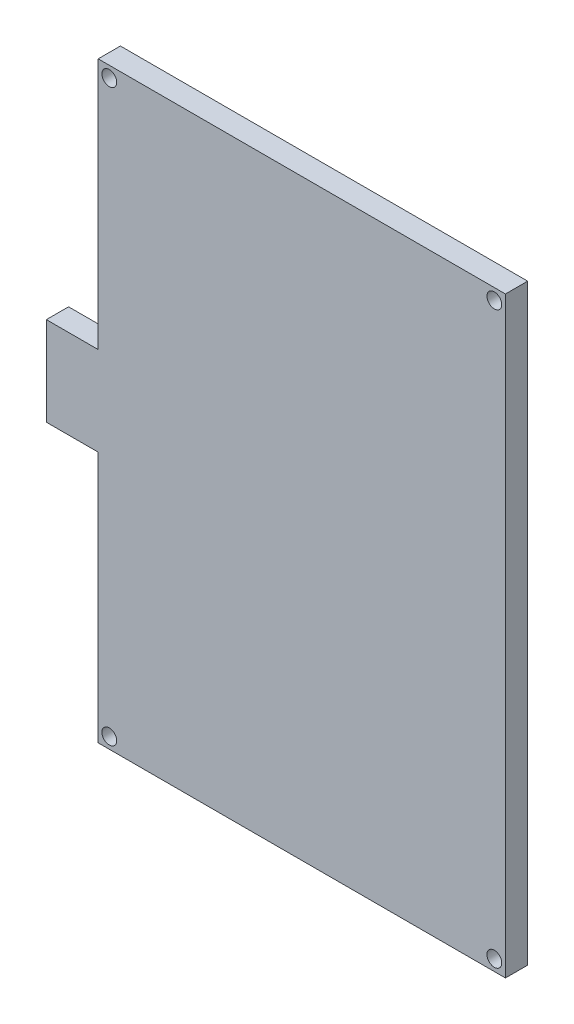
ISO-10303-21;
HEADER;
FILE_DESCRIPTION(('STEP AP214'),'2;1');
FILE_NAME('part.step','',(''),(''),'','','');
FILE_SCHEMA(('AUTOMOTIVE_DESIGN { 1 0 10303 214 1 1 1 1 }'));
ENDSEC;
DATA;
#1=APPLICATION_CONTEXT('core data for automotive mechanical design processes');
#2=APPLICATION_PROTOCOL_DEFINITION('international standard','automotive_design',2000,#1);
#3=PRODUCT_CONTEXT('',#1,'mechanical');
#4=PRODUCT('Part','Part','',(#3));
#5=PRODUCT_RELATED_PRODUCT_CATEGORY('part','',(#4));
#6=PRODUCT_DEFINITION_FORMATION('','',#4);
#7=PRODUCT_DEFINITION_CONTEXT('part definition',#1,'design');
#8=PRODUCT_DEFINITION('design','',#6,#7);
#9=PRODUCT_DEFINITION_SHAPE('','',#8);
#10=(LENGTH_UNIT() NAMED_UNIT(*) SI_UNIT(.MILLI.,.METRE.));
#11=(NAMED_UNIT(*) PLANE_ANGLE_UNIT() SI_UNIT($,.RADIAN.));
#12=(NAMED_UNIT(*) SI_UNIT($,.STERADIAN.) SOLID_ANGLE_UNIT());
#13=UNCERTAINTY_MEASURE_WITH_UNIT(LENGTH_MEASURE(1.E-05),#10,'distance_accuracy_value','');
#14=(GEOMETRIC_REPRESENTATION_CONTEXT(3) GLOBAL_UNCERTAINTY_ASSIGNED_CONTEXT((#13)) GLOBAL_UNIT_ASSIGNED_CONTEXT((#10,
#11,#12)) REPRESENTATION_CONTEXT('',''));
#15=CARTESIAN_POINT('',(0.,0.,0.));
#16=DIRECTION('',(0.,0.,1.));
#17=DIRECTION('',(1.,0.,0.));
#18=AXIS2_PLACEMENT_3D('',#15,#16,#17);
#19=CARTESIAN_POINT('',(0.,-6.00000000000001,-3.));
#20=DIRECTION('',(0.,-1.,0.));
#21=DIRECTION('',(1.,0.,0.));
#22=AXIS2_PLACEMENT_3D('',#19,#20,#21);
#23=PLANE('',#22);
#24=DIRECTION('',(1.,0.,0.));
#25=VECTOR('',#24,1.);
#26=CARTESIAN_POINT('',(0.,-6.00000000000001,0.));
#27=LINE('',#26,#25);
#28=CARTESIAN_POINT('',(-34.5,-6.,0.));
#29=VERTEX_POINT('',#28);
#30=CARTESIAN_POINT('',(-27.5,-6.,0.));
#31=VERTEX_POINT('',#30);
#32=EDGE_CURVE('E147',#29,#31,#27,.T.);
#33=ORIENTED_EDGE('',*,*,#32,.F.);
#34=DIRECTION('',(0.,0.,1.));
#35=VECTOR('',#34,1.);
#36=CARTESIAN_POINT('',(-34.5,-6.,-3.));
#37=LINE('',#36,#35);
#38=CARTESIAN_POINT('',(-34.5,-6.,-3.));
#39=VERTEX_POINT('',#38);
#40=EDGE_CURVE('E11',#39,#29,#37,.T.);
#41=ORIENTED_EDGE('',*,*,#40,.F.);
#42=DIRECTION('',(1.,0.,0.));
#43=VECTOR('',#42,1.);
#44=CARTESIAN_POINT('',(0.,-6.00000000000001,-3.));
#45=LINE('',#44,#43);
#46=CARTESIAN_POINT('',(-27.5,-6.,-3.));
#47=VERTEX_POINT('',#46);
#48=EDGE_CURVE('E175',#39,#47,#45,.T.);
#49=ORIENTED_EDGE('',*,*,#48,.T.);
#50=DIRECTION('',(0.,0.,1.));
#51=VECTOR('',#50,1.);
#52=CARTESIAN_POINT('',(-27.5,-6.,-3.));
#53=LINE('',#52,#51);
#54=EDGE_CURVE('E48',#47,#31,#53,.T.);
#55=ORIENTED_EDGE('',*,*,#54,.T.);
#56=EDGE_LOOP('',(#33,#41,#49,#55));
#57=FACE_BOUND('',#56,.T.);
#58=ADVANCED_FACE('F45',(#57),#23,.T.);
#59=CARTESIAN_POINT('',(-34.5,0.,-3.));
#60=DIRECTION('',(-1.,0.,0.));
#61=DIRECTION('',(0.,0.,1.));
#62=AXIS2_PLACEMENT_3D('',#59,#60,#61);
#63=PLANE('',#62);
#64=DIRECTION('',(0.,-1.,0.));
#65=VECTOR('',#64,1.);
#66=CARTESIAN_POINT('',(-34.5,0.,0.));
#67=LINE('',#66,#65);
#68=CARTESIAN_POINT('',(-34.5,6.,0.));
#69=VERTEX_POINT('',#68);
#70=EDGE_CURVE('E172',#69,#29,#67,.T.);
#71=ORIENTED_EDGE('',*,*,#70,.F.);
#72=DIRECTION('',(0.,0.,1.));
#73=VECTOR('',#72,1.);
#74=CARTESIAN_POINT('',(-34.5,6.,-3.));
#75=LINE('',#74,#73);
#76=CARTESIAN_POINT('',(-34.5,6.,-3.));
#77=VERTEX_POINT('',#76);
#78=EDGE_CURVE('E55',#77,#69,#75,.T.);
#79=ORIENTED_EDGE('',*,*,#78,.F.);
#80=DIRECTION('',(0.,-1.,0.));
#81=VECTOR('',#80,1.);
#82=CARTESIAN_POINT('',(-34.5,0.,-3.));
#83=LINE('',#82,#81);
#84=EDGE_CURVE('E132',#77,#39,#83,.T.);
#85=ORIENTED_EDGE('',*,*,#84,.T.);
#86=ORIENTED_EDGE('',*,*,#40,.T.);
#87=EDGE_LOOP('',(#71,#79,#85,#86));
#88=FACE_BOUND('',#87,.T.);
#89=ADVANCED_FACE('F194',(#88),#63,.T.);
#90=CARTESIAN_POINT('',(0.,6.,-3.));
#91=DIRECTION('',(0.,1.,0.));
#92=DIRECTION('',(0.,0.,1.));
#93=AXIS2_PLACEMENT_3D('',#90,#91,#92);
#94=PLANE('',#93);
#95=DIRECTION('',(-1.,0.,0.));
#96=VECTOR('',#95,1.);
#97=CARTESIAN_POINT('',(0.,6.,0.));
#98=LINE('',#97,#96);
#99=CARTESIAN_POINT('',(-27.5,6.,0.));
#100=VERTEX_POINT('',#99);
#101=EDGE_CURVE('E120',#100,#69,#98,.T.);
#102=ORIENTED_EDGE('',*,*,#101,.F.);
#103=DIRECTION('',(0.,0.,1.));
#104=VECTOR('',#103,1.);
#105=CARTESIAN_POINT('',(-27.5,6.,-3.));
#106=LINE('',#105,#104);
#107=CARTESIAN_POINT('',(-27.5,6.,-3.));
#108=VERTEX_POINT('',#107);
#109=EDGE_CURVE('E115',#108,#100,#106,.T.);
#110=ORIENTED_EDGE('',*,*,#109,.F.);
#111=DIRECTION('',(-1.,0.,0.));
#112=VECTOR('',#111,1.);
#113=CARTESIAN_POINT('',(0.,6.,-3.));
#114=LINE('',#113,#112);
#115=EDGE_CURVE('E118',#108,#77,#114,.T.);
#116=ORIENTED_EDGE('',*,*,#115,.T.);
#117=ORIENTED_EDGE('',*,*,#78,.T.);
#118=EDGE_LOOP('',(#102,#110,#116,#117));
#119=FACE_BOUND('',#118,.T.);
#120=ADVANCED_FACE('F117',(#119),#94,.T.);
#121=CARTESIAN_POINT('',(-27.5,0.,-3.));
#122=DIRECTION('',(-1.,0.,0.));
#123=DIRECTION('',(0.,-1.,0.));
#124=AXIS2_PLACEMENT_3D('',#121,#122,#123);
#125=PLANE('',#124);
#126=DIRECTION('',(0.,-1.,0.));
#127=VECTOR('',#126,1.);
#128=CARTESIAN_POINT('',(-27.5,0.,0.));
#129=LINE('',#128,#127);
#130=CARTESIAN_POINT('',(-27.5,40.,0.));
#131=VERTEX_POINT('',#130);
#132=EDGE_CURVE('E167',#131,#100,#129,.T.);
#133=ORIENTED_EDGE('',*,*,#132,.F.);
#134=DIRECTION('',(0.,0.,1.));
#135=VECTOR('',#134,1.);
#136=CARTESIAN_POINT('',(-27.5,40.,-3.));
#137=LINE('',#136,#135);
#138=CARTESIAN_POINT('',(-27.5,40.,-3.));
#139=VERTEX_POINT('',#138);
#140=EDGE_CURVE('E126',#139,#131,#137,.T.);
#141=ORIENTED_EDGE('',*,*,#140,.F.);
#142=DIRECTION('',(0.,-1.,0.));
#143=VECTOR('',#142,1.);
#144=CARTESIAN_POINT('',(-27.5,0.,-3.));
#145=LINE('',#144,#143);
#146=EDGE_CURVE('E131',#139,#108,#145,.T.);
#147=ORIENTED_EDGE('',*,*,#146,.T.);
#148=ORIENTED_EDGE('',*,*,#109,.T.);
#149=EDGE_LOOP('',(#133,#141,#147,#148));
#150=FACE_BOUND('',#149,.T.);
#151=ADVANCED_FACE('F135',(#150),#125,.T.);
#152=CARTESIAN_POINT('',(0.,40.,-3.));
#153=DIRECTION('',(0.,-1.,0.));
#154=DIRECTION('',(0.,0.,-1.));
#155=AXIS2_PLACEMENT_3D('',#152,#153,#154);
#156=PLANE('',#155);
#157=DIRECTION('',(1.,0.,0.));
#158=VECTOR('',#157,1.);
#159=CARTESIAN_POINT('',(0.,40.,0.));
#160=LINE('',#159,#158);
#161=CARTESIAN_POINT('',(27.5,40.,0.));
#162=VERTEX_POINT('',#161);
#163=EDGE_CURVE('E164',#131,#162,#160,.T.);
#164=ORIENTED_EDGE('',*,*,#163,.T.);
#165=DIRECTION('',(0.,0.,1.));
#166=VECTOR('',#165,1.);
#167=CARTESIAN_POINT('',(27.5,40.,-3.));
#168=LINE('',#167,#166);
#169=CARTESIAN_POINT('',(27.5,40.,-3.));
#170=VERTEX_POINT('',#169);
#171=EDGE_CURVE('E181',#170,#162,#168,.T.);
#172=ORIENTED_EDGE('',*,*,#171,.F.);
#173=DIRECTION('',(1.,0.,0.));
#174=VECTOR('',#173,1.);
#175=CARTESIAN_POINT('',(0.,40.,-3.));
#176=LINE('',#175,#174);
#177=EDGE_CURVE('E138',#139,#170,#176,.T.);
#178=ORIENTED_EDGE('',*,*,#177,.F.);
#179=ORIENTED_EDGE('',*,*,#140,.T.);
#180=EDGE_LOOP('',(#164,#172,#178,#179));
#181=FACE_BOUND('',#180,.T.);
#182=ADVANCED_FACE('F207',(#181),#156,.F.);
#183=CARTESIAN_POINT('',(27.5,0.,-3.));
#184=DIRECTION('',(-1.,0.,0.));
#185=DIRECTION('',(0.,-1.,0.));
#186=AXIS2_PLACEMENT_3D('',#183,#184,#185);
#187=PLANE('',#186);
#188=DIRECTION('',(0.,-1.,0.));
#189=VECTOR('',#188,1.);
#190=CARTESIAN_POINT('',(27.5,0.,0.));
#191=LINE('',#190,#189);
#192=CARTESIAN_POINT('',(27.5,-40.,0.));
#193=VERTEX_POINT('',#192);
#194=EDGE_CURVE('E160',#162,#193,#191,.T.);
#195=ORIENTED_EDGE('',*,*,#194,.T.);
#196=DIRECTION('',(0.,0.,1.));
#197=VECTOR('',#196,1.);
#198=CARTESIAN_POINT('',(27.5,-40.,-3.));
#199=LINE('',#198,#197);
#200=CARTESIAN_POINT('',(27.5,-40.,-3.));
#201=VERTEX_POINT('',#200);
#202=EDGE_CURVE('E185',#201,#193,#199,.T.);
#203=ORIENTED_EDGE('',*,*,#202,.F.);
#204=DIRECTION('',(0.,-1.,0.));
#205=VECTOR('',#204,1.);
#206=CARTESIAN_POINT('',(27.5,0.,-3.));
#207=LINE('',#206,#205);
#208=EDGE_CURVE('E141',#170,#201,#207,.T.);
#209=ORIENTED_EDGE('',*,*,#208,.F.);
#210=ORIENTED_EDGE('',*,*,#171,.T.);
#211=EDGE_LOOP('',(#195,#203,#209,#210));
#212=FACE_BOUND('',#211,.T.);
#213=ADVANCED_FACE('F210',(#212),#187,.F.);
#214=CARTESIAN_POINT('',(0.,-40.,-3.));
#215=DIRECTION('',(0.,-1.,0.));
#216=DIRECTION('',(0.,0.,-1.));
#217=AXIS2_PLACEMENT_3D('',#214,#215,#216);
#218=PLANE('',#217);
#219=DIRECTION('',(1.,0.,0.));
#220=VECTOR('',#219,1.);
#221=CARTESIAN_POINT('',(0.,-40.,0.));
#222=LINE('',#221,#220);
#223=CARTESIAN_POINT('',(-27.5,-40.,0.));
#224=VERTEX_POINT('',#223);
#225=EDGE_CURVE('E156',#224,#193,#222,.T.);
#226=ORIENTED_EDGE('',*,*,#225,.F.);
#227=DIRECTION('',(0.,0.,1.));
#228=VECTOR('',#227,1.);
#229=CARTESIAN_POINT('',(-27.5,-40.,-3.));
#230=LINE('',#229,#228);
#231=CARTESIAN_POINT('',(-27.5,-40.,-3.));
#232=VERTEX_POINT('',#231);
#233=EDGE_CURVE('E187',#232,#224,#230,.T.);
#234=ORIENTED_EDGE('',*,*,#233,.F.);
#235=DIRECTION('',(1.,0.,0.));
#236=VECTOR('',#235,1.);
#237=CARTESIAN_POINT('',(0.,-40.,-3.));
#238=LINE('',#237,#236);
#239=EDGE_CURVE('E275',#232,#201,#238,.T.);
#240=ORIENTED_EDGE('',*,*,#239,.T.);
#241=ORIENTED_EDGE('',*,*,#202,.T.);
#242=EDGE_LOOP('',(#226,#234,#240,#241));
#243=FACE_BOUND('',#242,.T.);
#244=ADVANCED_FACE('F214',(#243),#218,.T.);
#245=CARTESIAN_POINT('',(-27.5,0.,-3.));
#246=DIRECTION('',(-1.,0.,0.));
#247=DIRECTION('',(0.,-1.,0.));
#248=AXIS2_PLACEMENT_3D('',#245,#246,#247);
#249=PLANE('',#248);
#250=DIRECTION('',(0.,-1.,0.));
#251=VECTOR('',#250,1.);
#252=CARTESIAN_POINT('',(-27.5,0.,0.));
#253=LINE('',#252,#251);
#254=EDGE_CURVE('E151',#31,#224,#253,.T.);
#255=ORIENTED_EDGE('',*,*,#254,.F.);
#256=ORIENTED_EDGE('',*,*,#54,.F.);
#257=DIRECTION('',(0.,-1.,0.));
#258=VECTOR('',#257,1.);
#259=CARTESIAN_POINT('',(-27.5,0.,-3.));
#260=LINE('',#259,#258);
#261=EDGE_CURVE('E272',#47,#232,#260,.T.);
#262=ORIENTED_EDGE('',*,*,#261,.T.);
#263=ORIENTED_EDGE('',*,*,#233,.T.);
#264=EDGE_LOOP('',(#255,#256,#262,#263));
#265=FACE_BOUND('',#264,.T.);
#266=ADVANCED_FACE('F191',(#265),#249,.T.);
#267=CARTESIAN_POINT('',(0.,0.,-3.));
#268=DIRECTION('',(0.,0.,1.));
#269=DIRECTION('',(1.,0.,0.));
#270=AXIS2_PLACEMENT_3D('',#267,#268,#269);
#271=PLANE('',#270);
#272=CARTESIAN_POINT('',(26.,-38.5,-3.));
#273=DIRECTION('',(0.,0.,1.));
#274=DIRECTION('',(1.,0.,0.));
#275=AXIS2_PLACEMENT_3D('',#272,#273,#274);
#276=CIRCLE('',#275,1.);
#277=CARTESIAN_POINT('',(27.,-38.5,-3.));
#278=VERTEX_POINT('',#277);
#279=EDGE_CURVE('E152',#278,#278,#276,.T.);
#280=ORIENTED_EDGE('',*,*,#279,.T.);
#281=EDGE_LOOP('',(#280));
#282=FACE_BOUND('',#281,.T.);
#283=CARTESIAN_POINT('',(-26.,-38.5,-3.));
#284=DIRECTION('',(0.,0.,1.));
#285=DIRECTION('',(1.,0.,0.));
#286=AXIS2_PLACEMENT_3D('',#283,#284,#285);
#287=CIRCLE('',#286,1.);
#288=CARTESIAN_POINT('',(-25.,-38.5,-3.));
#289=VERTEX_POINT('',#288);
#290=EDGE_CURVE('E256',#289,#289,#287,.T.);
#291=ORIENTED_EDGE('',*,*,#290,.T.);
#292=EDGE_LOOP('',(#291));
#293=FACE_BOUND('',#292,.T.);
#294=CARTESIAN_POINT('',(-26.,38.5,-3.));
#295=DIRECTION('',(0.,0.,1.));
#296=DIRECTION('',(1.,0.,0.));
#297=AXIS2_PLACEMENT_3D('',#294,#295,#296);
#298=CIRCLE('',#297,1.);
#299=CARTESIAN_POINT('',(-25.,38.5,-3.));
#300=VERTEX_POINT('',#299);
#301=EDGE_CURVE('E253',#300,#300,#298,.T.);
#302=ORIENTED_EDGE('',*,*,#301,.T.);
#303=EDGE_LOOP('',(#302));
#304=FACE_BOUND('',#303,.T.);
#305=CARTESIAN_POINT('',(26.,38.5,-3.));
#306=DIRECTION('',(0.,0.,1.));
#307=DIRECTION('',(1.,0.,0.));
#308=AXIS2_PLACEMENT_3D('',#305,#306,#307);
#309=CIRCLE('',#308,1.);
#310=CARTESIAN_POINT('',(27.,38.5,-3.));
#311=VERTEX_POINT('',#310);
#312=EDGE_CURVE('E257',#311,#311,#309,.T.);
#313=ORIENTED_EDGE('',*,*,#312,.T.);
#314=EDGE_LOOP('',(#313));
#315=FACE_BOUND('',#314,.T.);
#316=ORIENTED_EDGE('',*,*,#48,.F.);
#317=ORIENTED_EDGE('',*,*,#84,.F.);
#318=ORIENTED_EDGE('',*,*,#115,.F.);
#319=ORIENTED_EDGE('',*,*,#146,.F.);
#320=ORIENTED_EDGE('',*,*,#177,.T.);
#321=ORIENTED_EDGE('',*,*,#208,.T.);
#322=ORIENTED_EDGE('',*,*,#239,.F.);
#323=ORIENTED_EDGE('',*,*,#261,.F.);
#324=EDGE_LOOP('',(#316,#317,#318,#319,#320,#321,#322,#323));
#325=FACE_BOUND('',#324,.T.);
#326=ADVANCED_FACE('F130',(#282,#293,#304,#315,#325),#271,.F.);
#327=CARTESIAN_POINT('',(0.,0.,0.));
#328=DIRECTION('',(0.,0.,1.));
#329=DIRECTION('',(1.,0.,0.));
#330=AXIS2_PLACEMENT_3D('',#327,#328,#329);
#331=PLANE('',#330);
#332=CARTESIAN_POINT('',(26.,-38.5,0.));
#333=DIRECTION('',(0.,0.,1.));
#334=DIRECTION('',(1.,0.,0.));
#335=AXIS2_PLACEMENT_3D('',#332,#333,#334);
#336=CIRCLE('',#335,1.);
#337=CARTESIAN_POINT('',(27.,-38.5,0.));
#338=VERTEX_POINT('',#337);
#339=EDGE_CURVE('E290',#338,#338,#336,.T.);
#340=ORIENTED_EDGE('',*,*,#339,.F.);
#341=EDGE_LOOP('',(#340));
#342=FACE_BOUND('',#341,.T.);
#343=CARTESIAN_POINT('',(-26.,-38.5,0.));
#344=DIRECTION('',(0.,0.,1.));
#345=DIRECTION('',(1.,0.,0.));
#346=AXIS2_PLACEMENT_3D('',#343,#344,#345);
#347=CIRCLE('',#346,1.);
#348=CARTESIAN_POINT('',(-25.,-38.5,0.));
#349=VERTEX_POINT('',#348);
#350=EDGE_CURVE('E294',#349,#349,#347,.T.);
#351=ORIENTED_EDGE('',*,*,#350,.F.);
#352=EDGE_LOOP('',(#351));
#353=FACE_BOUND('',#352,.T.);
#354=CARTESIAN_POINT('',(-26.,38.5,0.));
#355=DIRECTION('',(0.,0.,1.));
#356=DIRECTION('',(1.,0.,0.));
#357=AXIS2_PLACEMENT_3D('',#354,#355,#356);
#358=CIRCLE('',#357,1.);
#359=CARTESIAN_POINT('',(-25.,38.5,0.));
#360=VERTEX_POINT('',#359);
#361=EDGE_CURVE('E250',#360,#360,#358,.T.);
#362=ORIENTED_EDGE('',*,*,#361,.F.);
#363=EDGE_LOOP('',(#362));
#364=FACE_BOUND('',#363,.T.);
#365=CARTESIAN_POINT('',(26.,38.5,0.));
#366=DIRECTION('',(0.,0.,1.));
#367=DIRECTION('',(1.,0.,0.));
#368=AXIS2_PLACEMENT_3D('',#365,#366,#367);
#369=CIRCLE('',#368,1.);
#370=CARTESIAN_POINT('',(27.,38.5,0.));
#371=VERTEX_POINT('',#370);
#372=EDGE_CURVE('E264',#371,#371,#369,.T.);
#373=ORIENTED_EDGE('',*,*,#372,.F.);
#374=EDGE_LOOP('',(#373));
#375=FACE_BOUND('',#374,.T.);
#376=ORIENTED_EDGE('',*,*,#32,.T.);
#377=ORIENTED_EDGE('',*,*,#254,.T.);
#378=ORIENTED_EDGE('',*,*,#225,.T.);
#379=ORIENTED_EDGE('',*,*,#194,.F.);
#380=ORIENTED_EDGE('',*,*,#163,.F.);
#381=ORIENTED_EDGE('',*,*,#132,.T.);
#382=ORIENTED_EDGE('',*,*,#101,.T.);
#383=ORIENTED_EDGE('',*,*,#70,.T.);
#384=EDGE_LOOP('',(#376,#377,#378,#379,#380,#381,#382,#383));
#385=FACE_BOUND('',#384,.T.);
#386=ADVANCED_FACE('F193',(#342,#353,#364,#375,#385),#331,.T.);
#387=CARTESIAN_POINT('',(26.,38.5,-56.));
#388=DIRECTION('',(0.,0.,1.));
#389=DIRECTION('',(1.,0.,0.));
#390=AXIS2_PLACEMENT_3D('',#387,#388,#389);
#391=CYLINDRICAL_SURFACE('',#390,1.);
#392=ORIENTED_EDGE('',*,*,#372,.T.);
#393=EDGE_LOOP('',(#392));
#394=FACE_BOUND('',#393,.T.);
#395=ORIENTED_EDGE('',*,*,#312,.F.);
#396=EDGE_LOOP('',(#395));
#397=FACE_BOUND('',#396,.T.);
#398=ADVANCED_FACE('F226',(#394,#397),#391,.F.);
#399=CARTESIAN_POINT('',(-26.,38.5,-56.));
#400=DIRECTION('',(0.,0.,1.));
#401=DIRECTION('',(1.,0.,0.));
#402=AXIS2_PLACEMENT_3D('',#399,#400,#401);
#403=CYLINDRICAL_SURFACE('',#402,1.);
#404=ORIENTED_EDGE('',*,*,#361,.T.);
#405=EDGE_LOOP('',(#404));
#406=FACE_BOUND('',#405,.T.);
#407=ORIENTED_EDGE('',*,*,#301,.F.);
#408=EDGE_LOOP('',(#407));
#409=FACE_BOUND('',#408,.T.);
#410=ADVANCED_FACE('F233',(#406,#409),#403,.F.);
#411=CARTESIAN_POINT('',(-26.,-38.5,-56.));
#412=DIRECTION('',(0.,0.,1.));
#413=DIRECTION('',(1.,0.,0.));
#414=AXIS2_PLACEMENT_3D('',#411,#412,#413);
#415=CYLINDRICAL_SURFACE('',#414,1.);
#416=ORIENTED_EDGE('',*,*,#350,.T.);
#417=EDGE_LOOP('',(#416));
#418=FACE_BOUND('',#417,.T.);
#419=ORIENTED_EDGE('',*,*,#290,.F.);
#420=EDGE_LOOP('',(#419));
#421=FACE_BOUND('',#420,.T.);
#422=ADVANCED_FACE('F238',(#418,#421),#415,.F.);
#423=CARTESIAN_POINT('',(26.,-38.5,-56.));
#424=DIRECTION('',(0.,0.,1.));
#425=DIRECTION('',(1.,0.,0.));
#426=AXIS2_PLACEMENT_3D('',#423,#424,#425);
#427=CYLINDRICAL_SURFACE('',#426,1.);
#428=ORIENTED_EDGE('',*,*,#339,.T.);
#429=EDGE_LOOP('',(#428));
#430=FACE_BOUND('',#429,.T.);
#431=ORIENTED_EDGE('',*,*,#279,.F.);
#432=EDGE_LOOP('',(#431));
#433=FACE_BOUND('',#432,.T.);
#434=ADVANCED_FACE('F235',(#430,#433),#427,.F.);
#435=CLOSED_SHELL('',(#58,#89,#120,#151,#182,#213,#244,#266,#326,#386,#398,#410,#422,#434));
#436=MANIFOLD_SOLID_BREP('B2',#435);
#437=ADVANCED_BREP_SHAPE_REPRESENTATION('',(#18,#436),#14);
#438=SHAPE_DEFINITION_REPRESENTATION(#9,#437);
ENDSEC;
END-ISO-10303-21;
